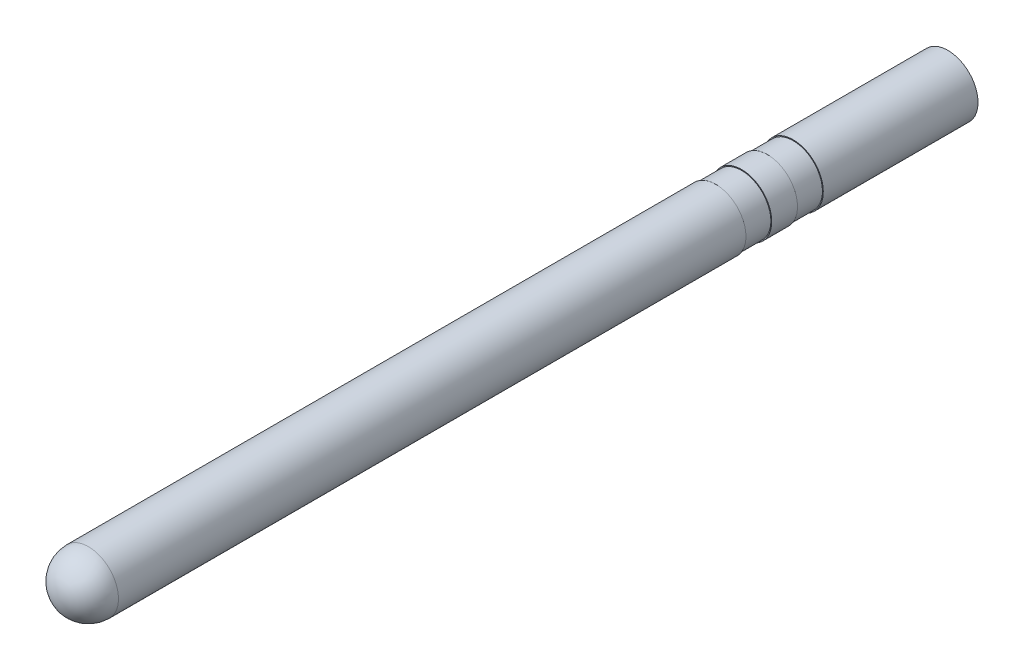
ISO-10303-21;
HEADER;
FILE_DESCRIPTION(('STEP AP214'),'2;1');
FILE_NAME('part.step','',(''),(''),'','','');
FILE_SCHEMA(('AUTOMOTIVE_DESIGN { 1 0 10303 214 1 1 1 1 }'));
ENDSEC;
DATA;
#1=APPLICATION_CONTEXT('core data for automotive mechanical design processes');
#2=APPLICATION_PROTOCOL_DEFINITION('international standard','automotive_design',2000,#1);
#3=PRODUCT_CONTEXT('',#1,'mechanical');
#4=PRODUCT('Part','Part','',(#3));
#5=PRODUCT_RELATED_PRODUCT_CATEGORY('part','',(#4));
#6=PRODUCT_DEFINITION_FORMATION('','',#4);
#7=PRODUCT_DEFINITION_CONTEXT('part definition',#1,'design');
#8=PRODUCT_DEFINITION('design','',#6,#7);
#9=PRODUCT_DEFINITION_SHAPE('','',#8);
#10=(LENGTH_UNIT() NAMED_UNIT(*) SI_UNIT(.MILLI.,.METRE.));
#11=(NAMED_UNIT(*) PLANE_ANGLE_UNIT() SI_UNIT($,.RADIAN.));
#12=(NAMED_UNIT(*) SI_UNIT($,.STERADIAN.) SOLID_ANGLE_UNIT());
#13=UNCERTAINTY_MEASURE_WITH_UNIT(LENGTH_MEASURE(1.E-05),#10,'distance_accuracy_value','');
#14=(GEOMETRIC_REPRESENTATION_CONTEXT(3) GLOBAL_UNCERTAINTY_ASSIGNED_CONTEXT((#13)) GLOBAL_UNIT_ASSIGNED_CONTEXT((#10,
#11,#12)) REPRESENTATION_CONTEXT('',''));
#15=CARTESIAN_POINT('',(0.,0.,0.));
#16=DIRECTION('',(0.,0.,1.));
#17=DIRECTION('',(1.,0.,0.));
#18=AXIS2_PLACEMENT_3D('',#15,#16,#17);
#19=CARTESIAN_POINT('',(0.,0.,100.536912751678));
#20=DIRECTION('',(0.,0.,1.));
#21=DIRECTION('',(0.,-1.,0.));
#22=AXIS2_PLACEMENT_3D('',#19,#20,#21);
#23=SPHERICAL_SURFACE('',#22,35.);
#24=CARTESIAN_POINT('',(0.,0.,100.536912751678));
#25=DIRECTION('',(0.,0.,1.));
#26=DIRECTION('',(0.,-1.,0.));
#27=AXIS2_PLACEMENT_3D('',#24,#25,#26);
#28=CIRCLE('',#27,35.);
#29=CARTESIAN_POINT('',(0.,-35.,100.536912751678));
#30=VERTEX_POINT('',#29);
#31=EDGE_CURVE('E12',#30,#30,#28,.T.);
#32=ORIENTED_EDGE('',*,*,#31,.T.);
#33=EDGE_LOOP('',(#32));
#34=FACE_BOUND('',#33,.T.);
#35=ADVANCED_FACE('F46',(#34),#23,.T.);
#36=CARTESIAN_POINT('',(0.,0.,135.536912751678));
#37=DIRECTION('',(0.,0.,1.));
#38=DIRECTION('',(0.,-1.,0.));
#39=AXIS2_PLACEMENT_3D('',#36,#37,#38);
#40=CYLINDRICAL_SURFACE('',#39,35.);
#41=CARTESIAN_POINT('',(0.,0.,-629.463087248322));
#42=DIRECTION('',(0.,0.,1.));
#43=DIRECTION('',(0.,-1.,0.));
#44=AXIS2_PLACEMENT_3D('',#41,#42,#43);
#45=CIRCLE('',#44,35.);
#46=CARTESIAN_POINT('',(0.,-35.,-629.463087248322));
#47=VERTEX_POINT('',#46);
#48=EDGE_CURVE('E52',#47,#47,#45,.T.);
#49=ORIENTED_EDGE('',*,*,#48,.T.);
#50=EDGE_LOOP('',(#49));
#51=FACE_BOUND('',#50,.T.);
#52=ORIENTED_EDGE('',*,*,#31,.F.);
#53=EDGE_LOOP('',(#52));
#54=FACE_BOUND('',#53,.T.);
#55=ADVANCED_FACE('F96',(#51,#54),#40,.T.);
#56=CARTESIAN_POINT('',(0.,-34.,-629.463087248322));
#57=DIRECTION('',(0.,0.,1.));
#58=DIRECTION('',(0.,-1.,0.));
#59=AXIS2_PLACEMENT_3D('',#56,#57,#58);
#60=PLANE('',#59);
#61=ORIENTED_EDGE('',*,*,#48,.F.);
#62=EDGE_LOOP('',(#61));
#63=FACE_BOUND('',#62,.T.);
#64=CARTESIAN_POINT('',(0.,0.,-629.463087248322));
#65=DIRECTION('',(0.,0.,1.));
#66=DIRECTION('',(0.,-1.,0.));
#67=AXIS2_PLACEMENT_3D('',#64,#65,#66);
#68=CIRCLE('',#67,34.);
#69=CARTESIAN_POINT('',(0.,-34.,-629.463087248322));
#70=VERTEX_POINT('',#69);
#71=EDGE_CURVE('E56',#70,#70,#68,.T.);
#72=ORIENTED_EDGE('',*,*,#71,.T.);
#73=EDGE_LOOP('',(#72));
#74=FACE_BOUND('',#73,.T.);
#75=ADVANCED_FACE('F100',(#63,#74),#60,.F.);
#76=CARTESIAN_POINT('',(0.,0.,135.536912751678));
#77=DIRECTION('',(0.,0.,1.));
#78=DIRECTION('',(0.,-1.,0.));
#79=AXIS2_PLACEMENT_3D('',#76,#77,#78);
#80=CYLINDRICAL_SURFACE('',#79,34.);
#81=ORIENTED_EDGE('',*,*,#71,.F.);
#82=EDGE_LOOP('',(#81));
#83=FACE_BOUND('',#82,.T.);
#84=CARTESIAN_POINT('',(0.,0.,-659.463087248322));
#85=DIRECTION('',(0.,0.,1.));
#86=DIRECTION('',(0.,-1.,0.));
#87=AXIS2_PLACEMENT_3D('',#84,#85,#86);
#88=CIRCLE('',#87,34.);
#89=CARTESIAN_POINT('',(0.,-34.,-659.463087248322));
#90=VERTEX_POINT('',#89);
#91=EDGE_CURVE('E60',#90,#90,#88,.T.);
#92=ORIENTED_EDGE('',*,*,#91,.T.);
#93=EDGE_LOOP('',(#92));
#94=FACE_BOUND('',#93,.T.);
#95=ADVANCED_FACE('F104',(#83,#94),#80,.T.);
#96=CARTESIAN_POINT('',(0.,-35.,-659.463087248322));
#97=DIRECTION('',(0.,0.,-1.));
#98=DIRECTION('',(0.,1.,0.));
#99=AXIS2_PLACEMENT_3D('',#96,#97,#98);
#100=PLANE('',#99);
#101=ORIENTED_EDGE('',*,*,#91,.F.);
#102=EDGE_LOOP('',(#101));
#103=FACE_BOUND('',#102,.T.);
#104=CARTESIAN_POINT('',(0.,0.,-659.463087248322));
#105=DIRECTION('',(0.,0.,1.));
#106=DIRECTION('',(0.,-1.,0.));
#107=AXIS2_PLACEMENT_3D('',#104,#105,#106);
#108=CIRCLE('',#107,35.);
#109=CARTESIAN_POINT('',(0.,-35.,-659.463087248322));
#110=VERTEX_POINT('',#109);
#111=EDGE_CURVE('E65',#110,#110,#108,.T.);
#112=ORIENTED_EDGE('',*,*,#111,.T.);
#113=EDGE_LOOP('',(#112));
#114=FACE_BOUND('',#113,.T.);
#115=ADVANCED_FACE('F111',(#103,#114),#100,.F.);
#116=CARTESIAN_POINT('',(0.,0.,135.536912751678));
#117=DIRECTION('',(0.,0.,1.));
#118=DIRECTION('',(0.,-1.,0.));
#119=AXIS2_PLACEMENT_3D('',#116,#117,#118);
#120=CYLINDRICAL_SURFACE('',#119,35.);
#121=ORIENTED_EDGE('',*,*,#111,.F.);
#122=EDGE_LOOP('',(#121));
#123=FACE_BOUND('',#122,.T.);
#124=CARTESIAN_POINT('',(0.,0.,-689.463087248322));
#125=DIRECTION('',(0.,0.,1.));
#126=DIRECTION('',(0.,-1.,0.));
#127=AXIS2_PLACEMENT_3D('',#124,#125,#126);
#128=CIRCLE('',#127,35.);
#129=CARTESIAN_POINT('',(0.,-35.,-689.463087248322));
#130=VERTEX_POINT('',#129);
#131=EDGE_CURVE('E68',#130,#130,#128,.T.);
#132=ORIENTED_EDGE('',*,*,#131,.T.);
#133=EDGE_LOOP('',(#132));
#134=FACE_BOUND('',#133,.T.);
#135=ADVANCED_FACE('F115',(#123,#134),#120,.T.);
#136=CARTESIAN_POINT('',(0.,-34.,-689.463087248322));
#137=DIRECTION('',(0.,0.,1.));
#138=DIRECTION('',(0.,-1.,0.));
#139=AXIS2_PLACEMENT_3D('',#136,#137,#138);
#140=PLANE('',#139);
#141=ORIENTED_EDGE('',*,*,#131,.F.);
#142=EDGE_LOOP('',(#141));
#143=FACE_BOUND('',#142,.T.);
#144=CARTESIAN_POINT('',(0.,0.,-689.463087248322));
#145=DIRECTION('',(0.,0.,1.));
#146=DIRECTION('',(0.,-1.,0.));
#147=AXIS2_PLACEMENT_3D('',#144,#145,#146);
#148=CIRCLE('',#147,34.);
#149=CARTESIAN_POINT('',(0.,-34.,-689.463087248322));
#150=VERTEX_POINT('',#149);
#151=EDGE_CURVE('E71',#150,#150,#148,.T.);
#152=ORIENTED_EDGE('',*,*,#151,.T.);
#153=EDGE_LOOP('',(#152));
#154=FACE_BOUND('',#153,.T.);
#155=ADVANCED_FACE('F119',(#143,#154),#140,.F.);
#156=CARTESIAN_POINT('',(0.,0.,135.536912751678));
#157=DIRECTION('',(0.,0.,1.));
#158=DIRECTION('',(0.,-1.,0.));
#159=AXIS2_PLACEMENT_3D('',#156,#157,#158);
#160=CYLINDRICAL_SURFACE('',#159,34.);
#161=ORIENTED_EDGE('',*,*,#151,.F.);
#162=EDGE_LOOP('',(#161));
#163=FACE_BOUND('',#162,.T.);
#164=CARTESIAN_POINT('',(0.,0.,-719.463087248322));
#165=DIRECTION('',(0.,0.,1.));
#166=DIRECTION('',(0.,-1.,0.));
#167=AXIS2_PLACEMENT_3D('',#164,#165,#166);
#168=CIRCLE('',#167,34.);
#169=CARTESIAN_POINT('',(0.,-34.,-719.463087248322));
#170=VERTEX_POINT('',#169);
#171=EDGE_CURVE('E74',#170,#170,#168,.T.);
#172=ORIENTED_EDGE('',*,*,#171,.T.);
#173=EDGE_LOOP('',(#172));
#174=FACE_BOUND('',#173,.T.);
#175=ADVANCED_FACE('F123',(#163,#174),#160,.T.);
#176=CARTESIAN_POINT('',(0.,-35.,-719.463087248322));
#177=DIRECTION('',(0.,0.,-1.));
#178=DIRECTION('',(0.,1.,0.));
#179=AXIS2_PLACEMENT_3D('',#176,#177,#178);
#180=PLANE('',#179);
#181=ORIENTED_EDGE('',*,*,#171,.F.);
#182=EDGE_LOOP('',(#181));
#183=FACE_BOUND('',#182,.T.);
#184=CARTESIAN_POINT('',(0.,0.,-719.463087248322));
#185=DIRECTION('',(0.,0.,1.));
#186=DIRECTION('',(0.,-1.,0.));
#187=AXIS2_PLACEMENT_3D('',#184,#185,#186);
#188=CIRCLE('',#187,35.);
#189=CARTESIAN_POINT('',(0.,-35.,-719.463087248322));
#190=VERTEX_POINT('',#189);
#191=EDGE_CURVE('E77',#190,#190,#188,.T.);
#192=ORIENTED_EDGE('',*,*,#191,.T.);
#193=EDGE_LOOP('',(#192));
#194=FACE_BOUND('',#193,.T.);
#195=ADVANCED_FACE('F92',(#183,#194),#180,.F.);
#196=CARTESIAN_POINT('',(0.,0.,135.536912751678));
#197=DIRECTION('',(0.,0.,1.));
#198=DIRECTION('',(0.,-1.,0.));
#199=AXIS2_PLACEMENT_3D('',#196,#197,#198);
#200=CYLINDRICAL_SURFACE('',#199,35.);
#201=ORIENTED_EDGE('',*,*,#191,.F.);
#202=EDGE_LOOP('',(#201));
#203=FACE_BOUND('',#202,.T.);
#204=CARTESIAN_POINT('',(0.,0.,-899.463087248322));
#205=DIRECTION('',(0.,0.,1.));
#206=DIRECTION('',(0.,-1.,0.));
#207=AXIS2_PLACEMENT_3D('',#204,#205,#206);
#208=CIRCLE('',#207,35.);
#209=CARTESIAN_POINT('',(0.,-35.,-899.463087248322));
#210=VERTEX_POINT('',#209);
#211=EDGE_CURVE('E80',#210,#210,#208,.T.);
#212=ORIENTED_EDGE('',*,*,#211,.T.);
#213=EDGE_LOOP('',(#212));
#214=FACE_BOUND('',#213,.T.);
#215=ADVANCED_FACE('F84',(#203,#214),#200,.T.);
#216=CARTESIAN_POINT('',(0.,-35.,-899.463087248322));
#217=DIRECTION('',(0.,0.,-1.));
#218=DIRECTION('',(0.,1.,0.));
#219=AXIS2_PLACEMENT_3D('',#216,#217,#218);
#220=PLANE('',#219);
#221=ORIENTED_EDGE('',*,*,#211,.F.);
#222=EDGE_LOOP('',(#221));
#223=FACE_BOUND('',#222,.T.);
#224=ADVANCED_FACE('F86',(#223),#220,.T.);
#225=CLOSED_SHELL('',(#35,#55,#75,#95,#115,#135,#155,#175,#195,#215,#224));
#226=MANIFOLD_SOLID_BREP('B2',#225);
#227=ADVANCED_BREP_SHAPE_REPRESENTATION('',(#18,#226),#14);
#228=SHAPE_DEFINITION_REPRESENTATION(#9,#227);
ENDSEC;
END-ISO-10303-21;
